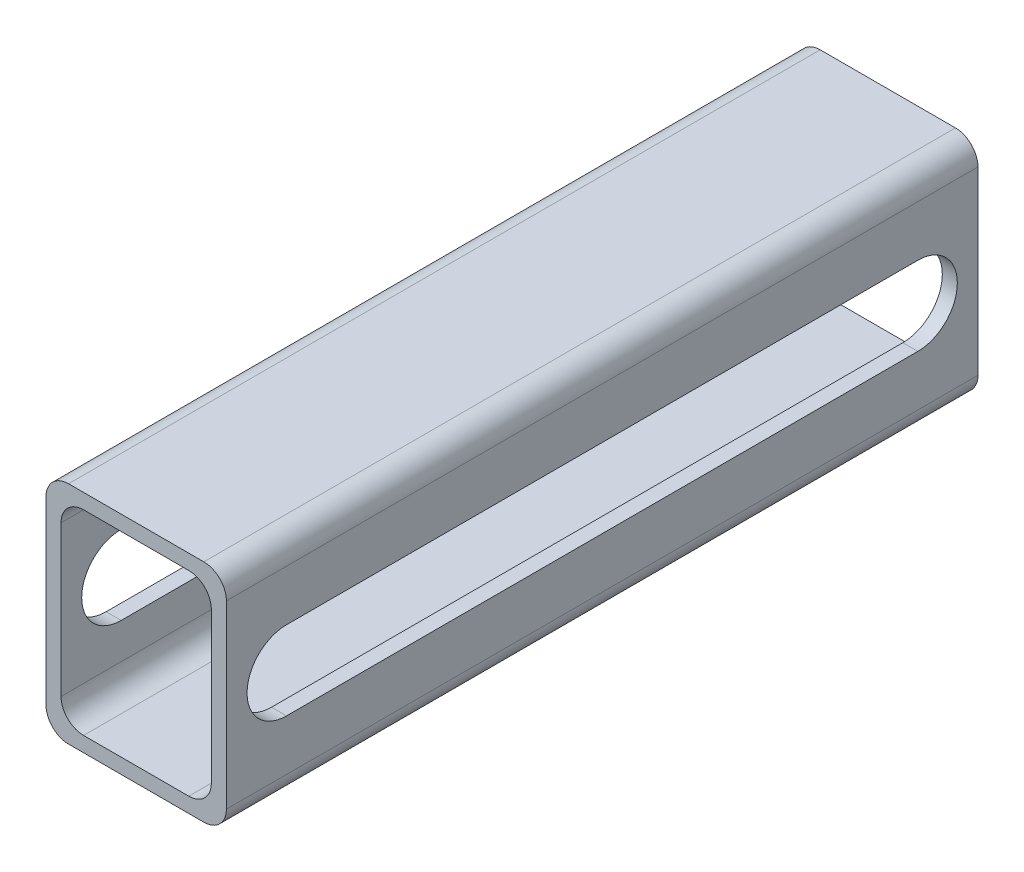
ISO-10303-21;
HEADER;
FILE_DESCRIPTION(('STEP AP214'),'2;1');
FILE_NAME('part.step','',(''),(''),'','','');
FILE_SCHEMA(('AUTOMOTIVE_DESIGN { 1 0 10303 214 1 1 1 1 }'));
ENDSEC;
DATA;
#1=APPLICATION_CONTEXT('core data for automotive mechanical design processes');
#2=APPLICATION_PROTOCOL_DEFINITION('international standard','automotive_design',2000,#1);
#3=PRODUCT_CONTEXT('',#1,'mechanical');
#4=PRODUCT('Part','Part','',(#3));
#5=PRODUCT_RELATED_PRODUCT_CATEGORY('part','',(#4));
#6=PRODUCT_DEFINITION_FORMATION('','',#4);
#7=PRODUCT_DEFINITION_CONTEXT('part definition',#1,'design');
#8=PRODUCT_DEFINITION('design','',#6,#7);
#9=PRODUCT_DEFINITION_SHAPE('','',#8);
#10=(LENGTH_UNIT() NAMED_UNIT(*) SI_UNIT(.MILLI.,.METRE.));
#11=(NAMED_UNIT(*) PLANE_ANGLE_UNIT() SI_UNIT($,.RADIAN.));
#12=(NAMED_UNIT(*) SI_UNIT($,.STERADIAN.) SOLID_ANGLE_UNIT());
#13=UNCERTAINTY_MEASURE_WITH_UNIT(LENGTH_MEASURE(1.E-05),#10,'distance_accuracy_value','');
#14=(GEOMETRIC_REPRESENTATION_CONTEXT(3) GLOBAL_UNCERTAINTY_ASSIGNED_CONTEXT((#13)) GLOBAL_UNIT_ASSIGNED_CONTEXT((#10,
#11,#12)) REPRESENTATION_CONTEXT('',''));
#15=CARTESIAN_POINT('',(0.,0.,0.));
#16=DIRECTION('',(0.,0.,1.));
#17=DIRECTION('',(1.,0.,0.));
#18=AXIS2_PLACEMENT_3D('',#15,#16,#17);
#19=CARTESIAN_POINT('',(9.00000000000001,-12.,-100.));
#20=DIRECTION('',(0.,0.,1.));
#21=DIRECTION('',(1.,0.,0.));
#22=AXIS2_PLACEMENT_3D('',#19,#20,#21);
#23=CYLINDRICAL_SURFACE('',#22,3.);
#24=CARTESIAN_POINT('',(9.00000000000001,-12.,0.));
#25=DIRECTION('',(0.,0.,1.));
#26=DIRECTION('',(1.,0.,0.));
#27=AXIS2_PLACEMENT_3D('',#24,#25,#26);
#28=CIRCLE('',#27,3.);
#29=CARTESIAN_POINT('',(9.,-15.,0.));
#30=VERTEX_POINT('',#29);
#31=CARTESIAN_POINT('',(12.,-12.,0.));
#32=VERTEX_POINT('',#31);
#33=EDGE_CURVE('E298',#30,#32,#28,.T.);
#34=ORIENTED_EDGE('',*,*,#33,.F.);
#35=DIRECTION('',(0.,0.,1.));
#36=VECTOR('',#35,1.);
#37=CARTESIAN_POINT('',(9.,-15.,-100.));
#38=LINE('',#37,#36);
#39=CARTESIAN_POINT('',(9.,-15.,-100.));
#40=VERTEX_POINT('',#39);
#41=EDGE_CURVE('E361',#40,#30,#38,.T.);
#42=ORIENTED_EDGE('',*,*,#41,.F.);
#43=CARTESIAN_POINT('',(9.00000000000001,-12.,-100.));
#44=DIRECTION('',(0.,0.,1.));
#45=DIRECTION('',(1.,0.,0.));
#46=AXIS2_PLACEMENT_3D('',#43,#44,#45);
#47=CIRCLE('',#46,3.);
#48=CARTESIAN_POINT('',(12.,-12.,-100.));
#49=VERTEX_POINT('',#48);
#50=EDGE_CURVE('E313',#40,#49,#47,.T.);
#51=ORIENTED_EDGE('',*,*,#50,.T.);
#52=DIRECTION('',(0.,0.,1.));
#53=VECTOR('',#52,1.);
#54=CARTESIAN_POINT('',(12.,-12.,-100.));
#55=LINE('',#54,#53);
#56=EDGE_CURVE('E338',#49,#32,#55,.T.);
#57=ORIENTED_EDGE('',*,*,#56,.T.);
#58=EDGE_LOOP('',(#34,#42,#51,#57));
#59=FACE_BOUND('',#58,.T.);
#60=ADVANCED_FACE('F33',(#59),#23,.T.);
#61=CARTESIAN_POINT('',(-9.,-15.,-100.));
#62=DIRECTION('',(0.,-1.,0.));
#63=DIRECTION('',(1.,0.,0.));
#64=AXIS2_PLACEMENT_3D('',#61,#62,#63);
#65=PLANE('',#64);
#66=DIRECTION('',(1.,0.,0.));
#67=VECTOR('',#66,1.);
#68=CARTESIAN_POINT('',(-9.,-15.,0.));
#69=LINE('',#68,#67);
#70=CARTESIAN_POINT('',(-9.,-15.,0.));
#71=VERTEX_POINT('',#70);
#72=EDGE_CURVE('E317',#71,#30,#69,.T.);
#73=ORIENTED_EDGE('',*,*,#72,.F.);
#74=DIRECTION('',(0.,0.,1.));
#75=VECTOR('',#74,1.);
#76=CARTESIAN_POINT('',(-9.,-15.,-100.));
#77=LINE('',#76,#75);
#78=CARTESIAN_POINT('',(-9.,-15.,-100.));
#79=VERTEX_POINT('',#78);
#80=EDGE_CURVE('E364',#79,#71,#77,.T.);
#81=ORIENTED_EDGE('',*,*,#80,.F.);
#82=DIRECTION('',(1.,0.,0.));
#83=VECTOR('',#82,1.);
#84=CARTESIAN_POINT('',(-9.,-15.,-100.));
#85=LINE('',#84,#83);
#86=EDGE_CURVE('E335',#79,#40,#85,.T.);
#87=ORIENTED_EDGE('',*,*,#86,.T.);
#88=ORIENTED_EDGE('',*,*,#41,.T.);
#89=EDGE_LOOP('',(#73,#81,#87,#88));
#90=FACE_BOUND('',#89,.T.);
#91=ADVANCED_FACE('F399',(#90),#65,.T.);
#92=CARTESIAN_POINT('',(-9.,-12.,-100.));
#93=DIRECTION('',(0.,0.,1.));
#94=DIRECTION('',(1.,0.,0.));
#95=AXIS2_PLACEMENT_3D('',#92,#93,#94);
#96=CYLINDRICAL_SURFACE('',#95,3.);
#97=CARTESIAN_POINT('',(-9.,-12.,0.));
#98=DIRECTION('',(0.,0.,1.));
#99=DIRECTION('',(-1.,0.,0.));
#100=AXIS2_PLACEMENT_3D('',#97,#98,#99);
#101=CIRCLE('',#100,3.);
#102=CARTESIAN_POINT('',(-12.,-12.,0.));
#103=VERTEX_POINT('',#102);
#104=EDGE_CURVE('E356',#103,#71,#101,.T.);
#105=ORIENTED_EDGE('',*,*,#104,.F.);
#106=DIRECTION('',(0.,0.,1.));
#107=VECTOR('',#106,1.);
#108=CARTESIAN_POINT('',(-12.,-12.,-100.));
#109=LINE('',#108,#107);
#110=CARTESIAN_POINT('',(-12.,-12.,-100.));
#111=VERTEX_POINT('',#110);
#112=EDGE_CURVE('E366',#111,#103,#109,.T.);
#113=ORIENTED_EDGE('',*,*,#112,.F.);
#114=CARTESIAN_POINT('',(-9.,-12.,-100.));
#115=DIRECTION('',(0.,0.,1.));
#116=DIRECTION('',(-1.,0.,0.));
#117=AXIS2_PLACEMENT_3D('',#114,#115,#116);
#118=CIRCLE('',#117,3.);
#119=EDGE_CURVE('E332',#111,#79,#118,.T.);
#120=ORIENTED_EDGE('',*,*,#119,.T.);
#121=ORIENTED_EDGE('',*,*,#80,.T.);
#122=EDGE_LOOP('',(#105,#113,#120,#121));
#123=FACE_BOUND('',#122,.T.);
#124=ADVANCED_FACE('F404',(#123),#96,.T.);
#125=CARTESIAN_POINT('',(-12.,-12.,-100.));
#126=DIRECTION('',(-1.,0.,0.));
#127=DIRECTION('',(0.,-1.,0.));
#128=AXIS2_PLACEMENT_3D('',#125,#126,#127);
#129=PLANE('',#128);
#130=CARTESIAN_POINT('',(-12.,0.,-92.));
#131=DIRECTION('',(-1.,0.,0.));
#132=DIRECTION('',(0.,-1.,0.));
#133=AXIS2_PLACEMENT_3D('',#130,#131,#132);
#134=CIRCLE('',#133,5.25);
#135=CARTESIAN_POINT('',(-12.,5.25,-92.));
#136=VERTEX_POINT('',#135);
#137=CARTESIAN_POINT('',(-12.,-5.25,-92.));
#138=VERTEX_POINT('',#137);
#139=EDGE_CURVE('E246',#136,#138,#134,.T.);
#140=ORIENTED_EDGE('',*,*,#139,.F.);
#141=DIRECTION('',(0.,0.,-1.));
#142=VECTOR('',#141,1.);
#143=CARTESIAN_POINT('',(-12.,5.25,-100.));
#144=LINE('',#143,#142);
#145=CARTESIAN_POINT('',(-12.,5.24999999999999,-8.00000000000001));
#146=VERTEX_POINT('',#145);
#147=EDGE_CURVE('E231',#146,#136,#144,.T.);
#148=ORIENTED_EDGE('',*,*,#147,.F.);
#149=CARTESIAN_POINT('',(-12.,0.,-8.));
#150=DIRECTION('',(-1.,0.,0.));
#151=DIRECTION('',(0.,-1.,0.));
#152=AXIS2_PLACEMENT_3D('',#149,#150,#151);
#153=CIRCLE('',#152,5.25);
#154=CARTESIAN_POINT('',(-12.,-5.25000000000001,-8.));
#155=VERTEX_POINT('',#154);
#156=EDGE_CURVE('E236',#155,#146,#153,.T.);
#157=ORIENTED_EDGE('',*,*,#156,.F.);
#158=DIRECTION('',(0.,0.,1.));
#159=VECTOR('',#158,1.);
#160=CARTESIAN_POINT('',(-12.,-5.25,-100.));
#161=LINE('',#160,#159);
#162=EDGE_CURVE('E241',#138,#155,#161,.T.);
#163=ORIENTED_EDGE('',*,*,#162,.F.);
#164=EDGE_LOOP('',(#140,#148,#157,#163));
#165=FACE_BOUND('',#164,.T.);
#166=DIRECTION('',(0.,-1.,0.));
#167=VECTOR('',#166,1.);
#168=CARTESIAN_POINT('',(-12.,-12.,0.));
#169=LINE('',#168,#167);
#170=CARTESIAN_POINT('',(-12.,12.,0.));
#171=VERTEX_POINT('',#170);
#172=EDGE_CURVE('E353',#171,#103,#169,.T.);
#173=ORIENTED_EDGE('',*,*,#172,.F.);
#174=DIRECTION('',(0.,0.,1.));
#175=VECTOR('',#174,1.);
#176=CARTESIAN_POINT('',(-12.,12.,-100.));
#177=LINE('',#176,#175);
#178=CARTESIAN_POINT('',(-12.,12.,-100.));
#179=VERTEX_POINT('',#178);
#180=EDGE_CURVE('E368',#179,#171,#177,.T.);
#181=ORIENTED_EDGE('',*,*,#180,.F.);
#182=DIRECTION('',(0.,-1.,0.));
#183=VECTOR('',#182,1.);
#184=CARTESIAN_POINT('',(-12.,-12.,-100.));
#185=LINE('',#184,#183);
#186=EDGE_CURVE('E329',#179,#111,#185,.T.);
#187=ORIENTED_EDGE('',*,*,#186,.T.);
#188=ORIENTED_EDGE('',*,*,#112,.T.);
#189=EDGE_LOOP('',(#173,#181,#187,#188));
#190=FACE_BOUND('',#189,.T.);
#191=ADVANCED_FACE('F434',(#165,#190),#129,.T.);
#192=CARTESIAN_POINT('',(-9.00000000000001,12.,-100.));
#193=DIRECTION('',(0.,0.,1.));
#194=DIRECTION('',(1.,0.,0.));
#195=AXIS2_PLACEMENT_3D('',#192,#193,#194);
#196=CYLINDRICAL_SURFACE('',#195,3.);
#197=CARTESIAN_POINT('',(-9.00000000000001,12.,0.));
#198=DIRECTION('',(0.,0.,1.));
#199=DIRECTION('',(-1.,0.,0.));
#200=AXIS2_PLACEMENT_3D('',#197,#198,#199);
#201=CIRCLE('',#200,3.);
#202=CARTESIAN_POINT('',(-9.,15.,0.));
#203=VERTEX_POINT('',#202);
#204=EDGE_CURVE('E350',#203,#171,#201,.T.);
#205=ORIENTED_EDGE('',*,*,#204,.F.);
#206=DIRECTION('',(0.,0.,1.));
#207=VECTOR('',#206,1.);
#208=CARTESIAN_POINT('',(-9.,15.,-100.));
#209=LINE('',#208,#207);
#210=CARTESIAN_POINT('',(-9.,15.,-100.));
#211=VERTEX_POINT('',#210);
#212=EDGE_CURVE('E370',#211,#203,#209,.T.);
#213=ORIENTED_EDGE('',*,*,#212,.F.);
#214=CARTESIAN_POINT('',(-9.00000000000001,12.,-100.));
#215=DIRECTION('',(0.,0.,1.));
#216=DIRECTION('',(-1.,0.,0.));
#217=AXIS2_PLACEMENT_3D('',#214,#215,#216);
#218=CIRCLE('',#217,3.);
#219=EDGE_CURVE('E326',#211,#179,#218,.T.);
#220=ORIENTED_EDGE('',*,*,#219,.T.);
#221=ORIENTED_EDGE('',*,*,#180,.T.);
#222=EDGE_LOOP('',(#205,#213,#220,#221));
#223=FACE_BOUND('',#222,.T.);
#224=ADVANCED_FACE('F431',(#223),#196,.T.);
#225=CARTESIAN_POINT('',(-9.,15.,-100.));
#226=DIRECTION('',(0.,1.,0.));
#227=DIRECTION('',(-1.,0.,0.));
#228=AXIS2_PLACEMENT_3D('',#225,#226,#227);
#229=PLANE('',#228);
#230=DIRECTION('',(-1.,0.,0.));
#231=VECTOR('',#230,1.);
#232=CARTESIAN_POINT('',(-9.,15.,0.));
#233=LINE('',#232,#231);
#234=CARTESIAN_POINT('',(9.,15.,0.));
#235=VERTEX_POINT('',#234);
#236=EDGE_CURVE('E347',#235,#203,#233,.T.);
#237=ORIENTED_EDGE('',*,*,#236,.F.);
#238=DIRECTION('',(0.,0.,1.));
#239=VECTOR('',#238,1.);
#240=CARTESIAN_POINT('',(9.,15.,-100.));
#241=LINE('',#240,#239);
#242=CARTESIAN_POINT('',(9.,15.,-100.));
#243=VERTEX_POINT('',#242);
#244=EDGE_CURVE('E372',#243,#235,#241,.T.);
#245=ORIENTED_EDGE('',*,*,#244,.F.);
#246=DIRECTION('',(-1.,0.,0.));
#247=VECTOR('',#246,1.);
#248=CARTESIAN_POINT('',(-9.,15.,-100.));
#249=LINE('',#248,#247);
#250=EDGE_CURVE('E323',#243,#211,#249,.T.);
#251=ORIENTED_EDGE('',*,*,#250,.T.);
#252=ORIENTED_EDGE('',*,*,#212,.T.);
#253=EDGE_LOOP('',(#237,#245,#251,#252));
#254=FACE_BOUND('',#253,.T.);
#255=ADVANCED_FACE('F427',(#254),#229,.T.);
#256=CARTESIAN_POINT('',(9.00000000000001,12.,-100.));
#257=DIRECTION('',(0.,0.,1.));
#258=DIRECTION('',(1.,0.,0.));
#259=AXIS2_PLACEMENT_3D('',#256,#257,#258);
#260=CYLINDRICAL_SURFACE('',#259,3.);
#261=CARTESIAN_POINT('',(9.00000000000001,12.,0.));
#262=DIRECTION('',(0.,0.,1.));
#263=DIRECTION('',(-1.,0.,0.));
#264=AXIS2_PLACEMENT_3D('',#261,#262,#263);
#265=CIRCLE('',#264,3.);
#266=CARTESIAN_POINT('',(12.,12.,0.));
#267=VERTEX_POINT('',#266);
#268=EDGE_CURVE('E344',#267,#235,#265,.T.);
#269=ORIENTED_EDGE('',*,*,#268,.F.);
#270=DIRECTION('',(0.,0.,1.));
#271=VECTOR('',#270,1.);
#272=CARTESIAN_POINT('',(12.,12.,-100.));
#273=LINE('',#272,#271);
#274=CARTESIAN_POINT('',(12.,12.,-100.));
#275=VERTEX_POINT('',#274);
#276=EDGE_CURVE('E374',#275,#267,#273,.T.);
#277=ORIENTED_EDGE('',*,*,#276,.F.);
#278=CARTESIAN_POINT('',(9.00000000000001,12.,-100.));
#279=DIRECTION('',(0.,0.,1.));
#280=DIRECTION('',(-1.,0.,0.));
#281=AXIS2_PLACEMENT_3D('',#278,#279,#280);
#282=CIRCLE('',#281,3.);
#283=EDGE_CURVE('E320',#275,#243,#282,.T.);
#284=ORIENTED_EDGE('',*,*,#283,.T.);
#285=ORIENTED_EDGE('',*,*,#244,.T.);
#286=EDGE_LOOP('',(#269,#277,#284,#285));
#287=FACE_BOUND('',#286,.T.);
#288=ADVANCED_FACE('F425',(#287),#260,.T.);
#289=CARTESIAN_POINT('',(12.,-12.,-100.));
#290=DIRECTION('',(1.,0.,0.));
#291=DIRECTION('',(0.,0.,-1.));
#292=AXIS2_PLACEMENT_3D('',#289,#290,#291);
#293=PLANE('',#292);
#294=CARTESIAN_POINT('',(12.,0.,-92.));
#295=DIRECTION('',(1.,0.,0.));
#296=DIRECTION('',(0.,0.,-1.));
#297=AXIS2_PLACEMENT_3D('',#294,#295,#296);
#298=CIRCLE('',#297,5.25);
#299=CARTESIAN_POINT('',(12.,-5.25,-92.));
#300=VERTEX_POINT('',#299);
#301=CARTESIAN_POINT('',(12.,5.25,-92.));
#302=VERTEX_POINT('',#301);
#303=EDGE_CURVE('E55',#300,#302,#298,.T.);
#304=ORIENTED_EDGE('',*,*,#303,.F.);
#305=DIRECTION('',(0.,0.,-1.));
#306=VECTOR('',#305,1.);
#307=CARTESIAN_POINT('',(12.,-5.25,-92.));
#308=LINE('',#307,#306);
#309=CARTESIAN_POINT('',(12.,-5.25000000000001,-8.));
#310=VERTEX_POINT('',#309);
#311=EDGE_CURVE('E216',#310,#300,#308,.T.);
#312=ORIENTED_EDGE('',*,*,#311,.F.);
#313=CARTESIAN_POINT('',(12.,0.,-8.));
#314=DIRECTION('',(1.,0.,0.));
#315=DIRECTION('',(0.,0.,-1.));
#316=AXIS2_PLACEMENT_3D('',#313,#314,#315);
#317=CIRCLE('',#316,5.25);
#318=CARTESIAN_POINT('',(12.,5.24999999999999,-8.));
#319=VERTEX_POINT('',#318);
#320=EDGE_CURVE('E199',#319,#310,#317,.T.);
#321=ORIENTED_EDGE('',*,*,#320,.F.);
#322=DIRECTION('',(0.,0.,1.));
#323=VECTOR('',#322,1.);
#324=CARTESIAN_POINT('',(12.,5.25,-92.));
#325=LINE('',#324,#323);
#326=EDGE_CURVE('E208',#302,#319,#325,.T.);
#327=ORIENTED_EDGE('',*,*,#326,.F.);
#328=EDGE_LOOP('',(#304,#312,#321,#327));
#329=FACE_BOUND('',#328,.T.);
#330=DIRECTION('',(0.,1.,0.));
#331=VECTOR('',#330,1.);
#332=CARTESIAN_POINT('',(12.,-12.,0.));
#333=LINE('',#332,#331);
#334=EDGE_CURVE('E341',#32,#267,#333,.T.);
#335=ORIENTED_EDGE('',*,*,#334,.F.);
#336=ORIENTED_EDGE('',*,*,#56,.F.);
#337=DIRECTION('',(0.,1.,0.));
#338=VECTOR('',#337,1.);
#339=CARTESIAN_POINT('',(12.,-12.,-100.));
#340=LINE('',#339,#338);
#341=EDGE_CURVE('E316',#49,#275,#340,.T.);
#342=ORIENTED_EDGE('',*,*,#341,.T.);
#343=ORIENTED_EDGE('',*,*,#276,.T.);
#344=EDGE_LOOP('',(#335,#336,#342,#343));
#345=FACE_BOUND('',#344,.T.);
#346=ADVANCED_FACE('F213',(#329,#345),#293,.T.);
#347=CARTESIAN_POINT('',(9.00000000000001,-12.,-100.));
#348=DIRECTION('',(0.,0.,1.));
#349=DIRECTION('',(1.,0.,0.));
#350=AXIS2_PLACEMENT_3D('',#347,#348,#349);
#351=PLANE('',#350);
#352=DIRECTION('',(1.,0.,0.));
#353=VECTOR('',#352,1.);
#354=CARTESIAN_POINT('',(-7.,-13.,-100.));
#355=LINE('',#354,#353);
#356=CARTESIAN_POINT('',(-7.,-13.,-100.));
#357=VERTEX_POINT('',#356);
#358=CARTESIAN_POINT('',(7.,-13.,-100.));
#359=VERTEX_POINT('',#358);
#360=EDGE_CURVE('E271',#357,#359,#355,.T.);
#361=ORIENTED_EDGE('',*,*,#360,.T.);
#362=CARTESIAN_POINT('',(7.00000000000001,-10.,-100.));
#363=DIRECTION('',(0.,0.,1.));
#364=DIRECTION('',(1.,0.,0.));
#365=AXIS2_PLACEMENT_3D('',#362,#363,#364);
#366=CIRCLE('',#365,3.);
#367=CARTESIAN_POINT('',(10.,-10.,-100.));
#368=VERTEX_POINT('',#367);
#369=EDGE_CURVE('E249',#359,#368,#366,.T.);
#370=ORIENTED_EDGE('',*,*,#369,.T.);
#371=DIRECTION('',(0.,1.,0.));
#372=VECTOR('',#371,1.);
#373=CARTESIAN_POINT('',(10.,-10.,-100.));
#374=LINE('',#373,#372);
#375=CARTESIAN_POINT('',(10.,10.,-100.));
#376=VERTEX_POINT('',#375);
#377=EDGE_CURVE('E252',#368,#376,#374,.T.);
#378=ORIENTED_EDGE('',*,*,#377,.T.);
#379=CARTESIAN_POINT('',(7.00000000000001,10.,-100.));
#380=DIRECTION('',(0.,0.,1.));
#381=DIRECTION('',(-1.,0.,0.));
#382=AXIS2_PLACEMENT_3D('',#379,#380,#381);
#383=CIRCLE('',#382,3.);
#384=CARTESIAN_POINT('',(7.,13.,-100.));
#385=VERTEX_POINT('',#384);
#386=EDGE_CURVE('E256',#376,#385,#383,.T.);
#387=ORIENTED_EDGE('',*,*,#386,.T.);
#388=DIRECTION('',(-1.,0.,0.));
#389=VECTOR('',#388,1.);
#390=CARTESIAN_POINT('',(-7.,13.,-100.));
#391=LINE('',#390,#389);
#392=CARTESIAN_POINT('',(-7.,13.,-100.));
#393=VERTEX_POINT('',#392);
#394=EDGE_CURVE('E259',#385,#393,#391,.T.);
#395=ORIENTED_EDGE('',*,*,#394,.T.);
#396=CARTESIAN_POINT('',(-7.00000000000001,10.,-100.));
#397=DIRECTION('',(0.,0.,1.));
#398=DIRECTION('',(-1.,0.,0.));
#399=AXIS2_PLACEMENT_3D('',#396,#397,#398);
#400=CIRCLE('',#399,3.);
#401=CARTESIAN_POINT('',(-10.,10.,-100.));
#402=VERTEX_POINT('',#401);
#403=EDGE_CURVE('E262',#393,#402,#400,.T.);
#404=ORIENTED_EDGE('',*,*,#403,.T.);
#405=DIRECTION('',(0.,-1.,0.));
#406=VECTOR('',#405,1.);
#407=CARTESIAN_POINT('',(-10.,-10.,-100.));
#408=LINE('',#407,#406);
#409=CARTESIAN_POINT('',(-10.,-10.,-100.));
#410=VERTEX_POINT('',#409);
#411=EDGE_CURVE('E265',#402,#410,#408,.T.);
#412=ORIENTED_EDGE('',*,*,#411,.T.);
#413=CARTESIAN_POINT('',(-7.,-10.,-100.));
#414=DIRECTION('',(0.,0.,1.));
#415=DIRECTION('',(-1.,0.,0.));
#416=AXIS2_PLACEMENT_3D('',#413,#414,#415);
#417=CIRCLE('',#416,3.);
#418=EDGE_CURVE('E268',#410,#357,#417,.T.);
#419=ORIENTED_EDGE('',*,*,#418,.T.);
#420=EDGE_LOOP('',(#361,#370,#378,#387,#395,#404,#412,#419));
#421=FACE_BOUND('',#420,.T.);
#422=ORIENTED_EDGE('',*,*,#50,.F.);
#423=ORIENTED_EDGE('',*,*,#86,.F.);
#424=ORIENTED_EDGE('',*,*,#119,.F.);
#425=ORIENTED_EDGE('',*,*,#186,.F.);
#426=ORIENTED_EDGE('',*,*,#219,.F.);
#427=ORIENTED_EDGE('',*,*,#250,.F.);
#428=ORIENTED_EDGE('',*,*,#283,.F.);
#429=ORIENTED_EDGE('',*,*,#341,.F.);
#430=EDGE_LOOP('',(#422,#423,#424,#425,#426,#427,#428,#429));
#431=FACE_BOUND('',#430,.T.);
#432=ADVANCED_FACE('F417',(#421,#431),#351,.F.);
#433=CARTESIAN_POINT('',(9.00000000000001,-12.,0.));
#434=DIRECTION('',(0.,0.,1.));
#435=DIRECTION('',(1.,0.,0.));
#436=AXIS2_PLACEMENT_3D('',#433,#434,#435);
#437=PLANE('',#436);
#438=CARTESIAN_POINT('',(7.00000000000001,-10.,0.));
#439=DIRECTION('',(0.,0.,1.));
#440=DIRECTION('',(1.,0.,0.));
#441=AXIS2_PLACEMENT_3D('',#438,#439,#440);
#442=CIRCLE('',#441,3.);
#443=CARTESIAN_POINT('',(7.,-13.,0.));
#444=VERTEX_POINT('',#443);
#445=CARTESIAN_POINT('',(10.,-10.,0.));
#446=VERTEX_POINT('',#445);
#447=EDGE_CURVE('E248',#444,#446,#442,.T.);
#448=ORIENTED_EDGE('',*,*,#447,.F.);
#449=DIRECTION('',(1.,0.,0.));
#450=VECTOR('',#449,1.);
#451=CARTESIAN_POINT('',(-7.,-13.,0.));
#452=LINE('',#451,#450);
#453=CARTESIAN_POINT('',(-7.,-13.,0.));
#454=VERTEX_POINT('',#453);
#455=EDGE_CURVE('E253',#454,#444,#452,.T.);
#456=ORIENTED_EDGE('',*,*,#455,.F.);
#457=CARTESIAN_POINT('',(-7.,-10.,0.));
#458=DIRECTION('',(0.,0.,1.));
#459=DIRECTION('',(-1.,0.,0.));
#460=AXIS2_PLACEMENT_3D('',#457,#458,#459);
#461=CIRCLE('',#460,3.);
#462=CARTESIAN_POINT('',(-10.,-10.,0.));
#463=VERTEX_POINT('',#462);
#464=EDGE_CURVE('E291',#463,#454,#461,.T.);
#465=ORIENTED_EDGE('',*,*,#464,.F.);
#466=DIRECTION('',(0.,-1.,0.));
#467=VECTOR('',#466,1.);
#468=CARTESIAN_POINT('',(-10.,-10.,0.));
#469=LINE('',#468,#467);
#470=CARTESIAN_POINT('',(-10.,10.,0.));
#471=VERTEX_POINT('',#470);
#472=EDGE_CURVE('E288',#471,#463,#469,.T.);
#473=ORIENTED_EDGE('',*,*,#472,.F.);
#474=CARTESIAN_POINT('',(-7.00000000000001,10.,0.));
#475=DIRECTION('',(0.,0.,1.));
#476=DIRECTION('',(-1.,0.,0.));
#477=AXIS2_PLACEMENT_3D('',#474,#475,#476);
#478=CIRCLE('',#477,3.);
#479=CARTESIAN_POINT('',(-7.,13.,0.));
#480=VERTEX_POINT('',#479);
#481=EDGE_CURVE('E285',#480,#471,#478,.T.);
#482=ORIENTED_EDGE('',*,*,#481,.F.);
#483=DIRECTION('',(-1.,0.,0.));
#484=VECTOR('',#483,1.);
#485=CARTESIAN_POINT('',(-7.,13.,0.));
#486=LINE('',#485,#484);
#487=CARTESIAN_POINT('',(7.,13.,0.));
#488=VERTEX_POINT('',#487);
#489=EDGE_CURVE('E282',#488,#480,#486,.T.);
#490=ORIENTED_EDGE('',*,*,#489,.F.);
#491=CARTESIAN_POINT('',(7.00000000000001,10.,0.));
#492=DIRECTION('',(0.,0.,1.));
#493=DIRECTION('',(-1.,0.,0.));
#494=AXIS2_PLACEMENT_3D('',#491,#492,#493);
#495=CIRCLE('',#494,3.);
#496=CARTESIAN_POINT('',(10.,10.,0.));
#497=VERTEX_POINT('',#496);
#498=EDGE_CURVE('E279',#497,#488,#495,.T.);
#499=ORIENTED_EDGE('',*,*,#498,.F.);
#500=DIRECTION('',(0.,1.,0.));
#501=VECTOR('',#500,1.);
#502=CARTESIAN_POINT('',(10.,-10.,0.));
#503=LINE('',#502,#501);
#504=EDGE_CURVE('E276',#446,#497,#503,.T.);
#505=ORIENTED_EDGE('',*,*,#504,.F.);
#506=EDGE_LOOP('',(#448,#456,#465,#473,#482,#490,#499,#505));
#507=FACE_BOUND('',#506,.T.);
#508=ORIENTED_EDGE('',*,*,#33,.T.);
#509=ORIENTED_EDGE('',*,*,#334,.T.);
#510=ORIENTED_EDGE('',*,*,#268,.T.);
#511=ORIENTED_EDGE('',*,*,#236,.T.);
#512=ORIENTED_EDGE('',*,*,#204,.T.);
#513=ORIENTED_EDGE('',*,*,#172,.T.);
#514=ORIENTED_EDGE('',*,*,#104,.T.);
#515=ORIENTED_EDGE('',*,*,#72,.T.);
#516=EDGE_LOOP('',(#508,#509,#510,#511,#512,#513,#514,#515));
#517=FACE_BOUND('',#516,.T.);
#518=ADVANCED_FACE('F412',(#507,#517),#437,.T.);
#519=CARTESIAN_POINT('',(7.00000000000001,-10.,-100.));
#520=DIRECTION('',(0.,0.,1.));
#521=DIRECTION('',(1.,0.,0.));
#522=AXIS2_PLACEMENT_3D('',#519,#520,#521);
#523=CYLINDRICAL_SURFACE('',#522,3.);
#524=ORIENTED_EDGE('',*,*,#447,.T.);
#525=DIRECTION('',(0.,0.,1.));
#526=VECTOR('',#525,1.);
#527=CARTESIAN_POINT('',(10.,-10.,-100.));
#528=LINE('',#527,#526);
#529=EDGE_CURVE('E274',#368,#446,#528,.T.);
#530=ORIENTED_EDGE('',*,*,#529,.F.);
#531=ORIENTED_EDGE('',*,*,#369,.F.);
#532=DIRECTION('',(0.,0.,1.));
#533=VECTOR('',#532,1.);
#534=CARTESIAN_POINT('',(7.,-13.,-100.));
#535=LINE('',#534,#533);
#536=EDGE_CURVE('E296',#359,#444,#535,.T.);
#537=ORIENTED_EDGE('',*,*,#536,.T.);
#538=EDGE_LOOP('',(#524,#530,#531,#537));
#539=FACE_BOUND('',#538,.T.);
#540=ADVANCED_FACE('F459',(#539),#523,.F.);
#541=CARTESIAN_POINT('',(-7.,-13.,-100.));
#542=DIRECTION('',(0.,-1.,0.));
#543=DIRECTION('',(1.,0.,0.));
#544=AXIS2_PLACEMENT_3D('',#541,#542,#543);
#545=PLANE('',#544);
#546=ORIENTED_EDGE('',*,*,#455,.T.);
#547=ORIENTED_EDGE('',*,*,#536,.F.);
#548=ORIENTED_EDGE('',*,*,#360,.F.);
#549=DIRECTION('',(0.,0.,1.));
#550=VECTOR('',#549,1.);
#551=CARTESIAN_POINT('',(-7.,-13.,-100.));
#552=LINE('',#551,#550);
#553=EDGE_CURVE('E299',#357,#454,#552,.T.);
#554=ORIENTED_EDGE('',*,*,#553,.T.);
#555=EDGE_LOOP('',(#546,#547,#548,#554));
#556=FACE_BOUND('',#555,.T.);
#557=ADVANCED_FACE('F464',(#556),#545,.F.);
#558=CARTESIAN_POINT('',(-7.,-10.,-100.));
#559=DIRECTION('',(0.,0.,1.));
#560=DIRECTION('',(1.,0.,0.));
#561=AXIS2_PLACEMENT_3D('',#558,#559,#560);
#562=CYLINDRICAL_SURFACE('',#561,3.);
#563=ORIENTED_EDGE('',*,*,#464,.T.);
#564=ORIENTED_EDGE('',*,*,#553,.F.);
#565=ORIENTED_EDGE('',*,*,#418,.F.);
#566=DIRECTION('',(0.,0.,1.));
#567=VECTOR('',#566,1.);
#568=CARTESIAN_POINT('',(-10.,-10.,-100.));
#569=LINE('',#568,#567);
#570=EDGE_CURVE('E301',#410,#463,#569,.T.);
#571=ORIENTED_EDGE('',*,*,#570,.T.);
#572=EDGE_LOOP('',(#563,#564,#565,#571));
#573=FACE_BOUND('',#572,.T.);
#574=ADVANCED_FACE('F483',(#573),#562,.F.);
#575=CARTESIAN_POINT('',(-10.,-10.,-100.));
#576=DIRECTION('',(-1.,0.,0.));
#577=DIRECTION('',(0.,-1.,0.));
#578=AXIS2_PLACEMENT_3D('',#575,#576,#577);
#579=PLANE('',#578);
#580=DIRECTION('',(0.,0.,-1.));
#581=VECTOR('',#580,1.);
#582=CARTESIAN_POINT('',(-10.,5.25,-100.));
#583=LINE('',#582,#581);
#584=CARTESIAN_POINT('',(-10.,5.24999999999999,-8.));
#585=VERTEX_POINT('',#584);
#586=CARTESIAN_POINT('',(-10.,5.25,-92.));
#587=VERTEX_POINT('',#586);
#588=EDGE_CURVE('E228',#585,#587,#583,.T.);
#589=ORIENTED_EDGE('',*,*,#588,.T.);
#590=CARTESIAN_POINT('',(-10.,0.,-92.));
#591=DIRECTION('',(-1.,0.,0.));
#592=DIRECTION('',(0.,-1.,0.));
#593=AXIS2_PLACEMENT_3D('',#590,#591,#592);
#594=CIRCLE('',#593,5.25);
#595=CARTESIAN_POINT('',(-10.,-5.25,-92.));
#596=VERTEX_POINT('',#595);
#597=EDGE_CURVE('E243',#587,#596,#594,.T.);
#598=ORIENTED_EDGE('',*,*,#597,.T.);
#599=DIRECTION('',(0.,0.,1.));
#600=VECTOR('',#599,1.);
#601=CARTESIAN_POINT('',(-10.,-5.25,-100.));
#602=LINE('',#601,#600);
#603=CARTESIAN_POINT('',(-10.,-5.25000000000001,-8.));
#604=VERTEX_POINT('',#603);
#605=EDGE_CURVE('E238',#596,#604,#602,.T.);
#606=ORIENTED_EDGE('',*,*,#605,.T.);
#607=CARTESIAN_POINT('',(-10.,0.,-8.));
#608=DIRECTION('',(-1.,0.,0.));
#609=DIRECTION('',(0.,-1.,0.));
#610=AXIS2_PLACEMENT_3D('',#607,#608,#609);
#611=CIRCLE('',#610,5.25);
#612=EDGE_CURVE('E233',#604,#585,#611,.T.);
#613=ORIENTED_EDGE('',*,*,#612,.T.);
#614=EDGE_LOOP('',(#589,#598,#606,#613));
#615=FACE_BOUND('',#614,.T.);
#616=ORIENTED_EDGE('',*,*,#472,.T.);
#617=ORIENTED_EDGE('',*,*,#570,.F.);
#618=ORIENTED_EDGE('',*,*,#411,.F.);
#619=DIRECTION('',(0.,0.,1.));
#620=VECTOR('',#619,1.);
#621=CARTESIAN_POINT('',(-10.,10.,-100.));
#622=LINE('',#621,#620);
#623=EDGE_CURVE('E303',#402,#471,#622,.T.);
#624=ORIENTED_EDGE('',*,*,#623,.T.);
#625=EDGE_LOOP('',(#616,#617,#618,#624));
#626=FACE_BOUND('',#625,.T.);
#627=ADVANCED_FACE('F479',(#615,#626),#579,.F.);
#628=CARTESIAN_POINT('',(-7.00000000000001,10.,-100.));
#629=DIRECTION('',(0.,0.,1.));
#630=DIRECTION('',(1.,0.,0.));
#631=AXIS2_PLACEMENT_3D('',#628,#629,#630);
#632=CYLINDRICAL_SURFACE('',#631,3.);
#633=ORIENTED_EDGE('',*,*,#481,.T.);
#634=ORIENTED_EDGE('',*,*,#623,.F.);
#635=ORIENTED_EDGE('',*,*,#403,.F.);
#636=DIRECTION('',(0.,0.,1.));
#637=VECTOR('',#636,1.);
#638=CARTESIAN_POINT('',(-7.,13.,-100.));
#639=LINE('',#638,#637);
#640=EDGE_CURVE('E305',#393,#480,#639,.T.);
#641=ORIENTED_EDGE('',*,*,#640,.T.);
#642=EDGE_LOOP('',(#633,#634,#635,#641));
#643=FACE_BOUND('',#642,.T.);
#644=ADVANCED_FACE('F475',(#643),#632,.F.);
#645=CARTESIAN_POINT('',(-7.,13.,-100.));
#646=DIRECTION('',(0.,1.,0.));
#647=DIRECTION('',(-1.,0.,0.));
#648=AXIS2_PLACEMENT_3D('',#645,#646,#647);
#649=PLANE('',#648);
#650=ORIENTED_EDGE('',*,*,#489,.T.);
#651=ORIENTED_EDGE('',*,*,#640,.F.);
#652=ORIENTED_EDGE('',*,*,#394,.F.);
#653=DIRECTION('',(0.,0.,1.));
#654=VECTOR('',#653,1.);
#655=CARTESIAN_POINT('',(7.,13.,-100.));
#656=LINE('',#655,#654);
#657=EDGE_CURVE('E307',#385,#488,#656,.T.);
#658=ORIENTED_EDGE('',*,*,#657,.T.);
#659=EDGE_LOOP('',(#650,#651,#652,#658));
#660=FACE_BOUND('',#659,.T.);
#661=ADVANCED_FACE('F471',(#660),#649,.F.);
#662=CARTESIAN_POINT('',(7.00000000000001,10.,-100.));
#663=DIRECTION('',(0.,0.,1.));
#664=DIRECTION('',(1.,0.,0.));
#665=AXIS2_PLACEMENT_3D('',#662,#663,#664);
#666=CYLINDRICAL_SURFACE('',#665,3.);
#667=ORIENTED_EDGE('',*,*,#498,.T.);
#668=ORIENTED_EDGE('',*,*,#657,.F.);
#669=ORIENTED_EDGE('',*,*,#386,.F.);
#670=DIRECTION('',(0.,0.,1.));
#671=VECTOR('',#670,1.);
#672=CARTESIAN_POINT('',(10.,10.,-100.));
#673=LINE('',#672,#671);
#674=EDGE_CURVE('E309',#376,#497,#673,.T.);
#675=ORIENTED_EDGE('',*,*,#674,.T.);
#676=EDGE_LOOP('',(#667,#668,#669,#675));
#677=FACE_BOUND('',#676,.T.);
#678=ADVANCED_FACE('F468',(#677),#666,.F.);
#679=CARTESIAN_POINT('',(10.,-10.,-100.));
#680=DIRECTION('',(1.,0.,0.));
#681=DIRECTION('',(0.,0.,-1.));
#682=AXIS2_PLACEMENT_3D('',#679,#680,#681);
#683=PLANE('',#682);
#684=DIRECTION('',(0.,0.,-1.));
#685=VECTOR('',#684,1.);
#686=CARTESIAN_POINT('',(10.,-5.25,-100.));
#687=LINE('',#686,#685);
#688=CARTESIAN_POINT('',(10.,-5.25000000000001,-8.));
#689=VERTEX_POINT('',#688);
#690=CARTESIAN_POINT('',(10.,-5.25,-92.));
#691=VERTEX_POINT('',#690);
#692=EDGE_CURVE('E40',#689,#691,#687,.T.);
#693=ORIENTED_EDGE('',*,*,#692,.T.);
#694=CARTESIAN_POINT('',(10.,0.,-92.));
#695=DIRECTION('',(1.,0.,0.));
#696=DIRECTION('',(0.,0.,-1.));
#697=AXIS2_PLACEMENT_3D('',#694,#695,#696);
#698=CIRCLE('',#697,5.25);
#699=CARTESIAN_POINT('',(10.,5.25,-92.));
#700=VERTEX_POINT('',#699);
#701=EDGE_CURVE('E11',#691,#700,#698,.T.);
#702=ORIENTED_EDGE('',*,*,#701,.T.);
#703=DIRECTION('',(0.,0.,1.));
#704=VECTOR('',#703,1.);
#705=CARTESIAN_POINT('',(10.,5.25,-100.));
#706=LINE('',#705,#704);
#707=CARTESIAN_POINT('',(10.,5.24999999999999,-8.00000000000001));
#708=VERTEX_POINT('',#707);
#709=EDGE_CURVE('E363',#700,#708,#706,.T.);
#710=ORIENTED_EDGE('',*,*,#709,.T.);
#711=CARTESIAN_POINT('',(10.,0.,-8.));
#712=DIRECTION('',(1.,0.,0.));
#713=DIRECTION('',(0.,0.,-1.));
#714=AXIS2_PLACEMENT_3D('',#711,#712,#713);
#715=CIRCLE('',#714,5.25);
#716=EDGE_CURVE('E202',#708,#689,#715,.T.);
#717=ORIENTED_EDGE('',*,*,#716,.T.);
#718=EDGE_LOOP('',(#693,#702,#710,#717));
#719=FACE_BOUND('',#718,.T.);
#720=ORIENTED_EDGE('',*,*,#504,.T.);
#721=ORIENTED_EDGE('',*,*,#674,.F.);
#722=ORIENTED_EDGE('',*,*,#377,.F.);
#723=ORIENTED_EDGE('',*,*,#529,.T.);
#724=EDGE_LOOP('',(#720,#721,#722,#723));
#725=FACE_BOUND('',#724,.T.);
#726=ADVANCED_FACE('F380',(#719,#725),#683,.F.);
#727=CARTESIAN_POINT('',(-24.,5.25,-92.));
#728=DIRECTION('',(0.,1.,0.));
#729=DIRECTION('',(0.,0.,1.));
#730=AXIS2_PLACEMENT_3D('',#727,#728,#729);
#731=PLANE('',#730);
#732=DIRECTION('',(1.,0.,0.));
#733=VECTOR('',#732,1.);
#734=CARTESIAN_POINT('',(-24.,5.25,-92.));
#735=LINE('',#734,#733);
#736=EDGE_CURVE('E210',#700,#302,#735,.T.);
#737=ORIENTED_EDGE('',*,*,#736,.T.);
#738=ORIENTED_EDGE('',*,*,#326,.T.);
#739=DIRECTION('',(1.,0.,0.));
#740=VECTOR('',#739,1.);
#741=CARTESIAN_POINT('',(-24.,5.24999999999999,-8.));
#742=LINE('',#741,#740);
#743=EDGE_CURVE('E194',#708,#319,#742,.T.);
#744=ORIENTED_EDGE('',*,*,#743,.F.);
#745=ORIENTED_EDGE('',*,*,#709,.F.);
#746=EDGE_LOOP('',(#737,#738,#744,#745));
#747=FACE_BOUND('',#746,.T.);
#748=ADVANCED_FACE('F209',(#747),#731,.F.);
#749=CARTESIAN_POINT('',(-24.,0.,-8.));
#750=DIRECTION('',(1.,0.,0.));
#751=DIRECTION('',(0.,0.,-1.));
#752=AXIS2_PLACEMENT_3D('',#749,#750,#751);
#753=CYLINDRICAL_SURFACE('',#752,5.25);
#754=ORIENTED_EDGE('',*,*,#743,.T.);
#755=ORIENTED_EDGE('',*,*,#320,.T.);
#756=DIRECTION('',(1.,0.,0.));
#757=VECTOR('',#756,1.);
#758=CARTESIAN_POINT('',(-24.,-5.25000000000001,-8.));
#759=LINE('',#758,#757);
#760=EDGE_CURVE('E225',#689,#310,#759,.T.);
#761=ORIENTED_EDGE('',*,*,#760,.F.);
#762=ORIENTED_EDGE('',*,*,#716,.F.);
#763=EDGE_LOOP('',(#754,#755,#761,#762));
#764=FACE_BOUND('',#763,.T.);
#765=ADVANCED_FACE('F196',(#764),#753,.F.);
#766=CARTESIAN_POINT('',(-24.,-5.25,-92.));
#767=DIRECTION('',(0.,-1.,0.));
#768=DIRECTION('',(0.,0.,-1.));
#769=AXIS2_PLACEMENT_3D('',#766,#767,#768);
#770=PLANE('',#769);
#771=ORIENTED_EDGE('',*,*,#760,.T.);
#772=ORIENTED_EDGE('',*,*,#311,.T.);
#773=DIRECTION('',(1.,0.,0.));
#774=VECTOR('',#773,1.);
#775=CARTESIAN_POINT('',(-24.,-5.25,-92.));
#776=LINE('',#775,#774);
#777=EDGE_CURVE('E221',#691,#300,#776,.T.);
#778=ORIENTED_EDGE('',*,*,#777,.F.);
#779=ORIENTED_EDGE('',*,*,#692,.F.);
#780=EDGE_LOOP('',(#771,#772,#778,#779));
#781=FACE_BOUND('',#780,.T.);
#782=ADVANCED_FACE('F384',(#781),#770,.F.);
#783=CARTESIAN_POINT('',(-24.,0.,-92.));
#784=DIRECTION('',(1.,0.,0.));
#785=DIRECTION('',(0.,0.,-1.));
#786=AXIS2_PLACEMENT_3D('',#783,#784,#785);
#787=CYLINDRICAL_SURFACE('',#786,5.25);
#788=ORIENTED_EDGE('',*,*,#777,.T.);
#789=ORIENTED_EDGE('',*,*,#303,.T.);
#790=ORIENTED_EDGE('',*,*,#736,.F.);
#791=ORIENTED_EDGE('',*,*,#701,.F.);
#792=EDGE_LOOP('',(#788,#789,#790,#791));
#793=FACE_BOUND('',#792,.T.);
#794=ADVANCED_FACE('F385',(#793),#787,.F.);
#795=ORIENTED_EDGE('',*,*,#139,.T.);
#796=EDGE_CURVE('E223',#138,#596,#776,.T.);
#797=ORIENTED_EDGE('',*,*,#796,.T.);
#798=ORIENTED_EDGE('',*,*,#597,.F.);
#799=EDGE_CURVE('E205',#136,#587,#735,.T.);
#800=ORIENTED_EDGE('',*,*,#799,.F.);
#801=EDGE_LOOP('',(#795,#797,#798,#800));
#802=FACE_BOUND('',#801,.T.);
#803=ADVANCED_FACE('F387',(#802),#787,.F.);
#804=ORIENTED_EDGE('',*,*,#162,.T.);
#805=EDGE_CURVE('E224',#155,#604,#759,.T.);
#806=ORIENTED_EDGE('',*,*,#805,.T.);
#807=ORIENTED_EDGE('',*,*,#605,.F.);
#808=ORIENTED_EDGE('',*,*,#796,.F.);
#809=EDGE_LOOP('',(#804,#806,#807,#808));
#810=FACE_BOUND('',#809,.T.);
#811=ADVANCED_FACE('F393',(#810),#770,.F.);
#812=ORIENTED_EDGE('',*,*,#156,.T.);
#813=EDGE_CURVE('E47',#146,#585,#742,.T.);
#814=ORIENTED_EDGE('',*,*,#813,.T.);
#815=ORIENTED_EDGE('',*,*,#612,.F.);
#816=ORIENTED_EDGE('',*,*,#805,.F.);
#817=EDGE_LOOP('',(#812,#814,#815,#816));
#818=FACE_BOUND('',#817,.T.);
#819=ADVANCED_FACE('F547',(#818),#753,.F.);
#820=ORIENTED_EDGE('',*,*,#147,.T.);
#821=ORIENTED_EDGE('',*,*,#799,.T.);
#822=ORIENTED_EDGE('',*,*,#588,.F.);
#823=ORIENTED_EDGE('',*,*,#813,.F.);
#824=EDGE_LOOP('',(#820,#821,#822,#823));
#825=FACE_BOUND('',#824,.T.);
#826=ADVANCED_FACE('F541',(#825),#731,.F.);
#827=CLOSED_SHELL('',(#60,#91,#124,#191,#224,#255,#288,#346,#432,#518,#540,#557,#574,#627,#644,
#661,#678,#726,#748,#765,#782,#794,#803,#811,#819,#826));
#828=MANIFOLD_SOLID_BREP('B2',#827);
#829=ADVANCED_BREP_SHAPE_REPRESENTATION('',(#18,#828),#14);
#830=SHAPE_DEFINITION_REPRESENTATION(#9,#829);
ENDSEC;
END-ISO-10303-21;
